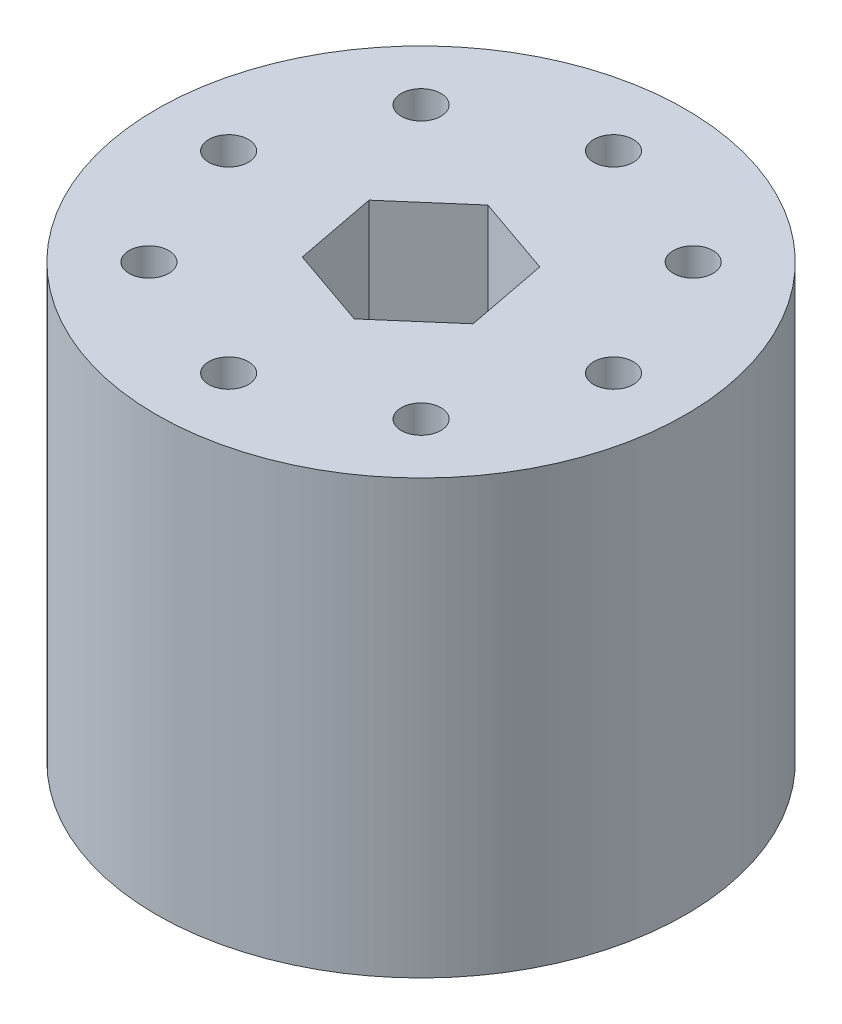
ISO-10303-21;
HEADER;
FILE_DESCRIPTION(('STEP AP214'),'2;1');
FILE_NAME('part.step','',(''),(''),'','','');
FILE_SCHEMA(('AUTOMOTIVE_DESIGN { 1 0 10303 214 1 1 1 1 }'));
ENDSEC;
DATA;
#1=APPLICATION_CONTEXT('core data for automotive mechanical design processes');
#2=APPLICATION_PROTOCOL_DEFINITION('international standard','automotive_design',2000,#1);
#3=PRODUCT_CONTEXT('',#1,'mechanical');
#4=PRODUCT('Part','Part','',(#3));
#5=PRODUCT_RELATED_PRODUCT_CATEGORY('part','',(#4));
#6=PRODUCT_DEFINITION_FORMATION('','',#4);
#7=PRODUCT_DEFINITION_CONTEXT('part definition',#1,'design');
#8=PRODUCT_DEFINITION('design','',#6,#7);
#9=PRODUCT_DEFINITION_SHAPE('','',#8);
#10=(LENGTH_UNIT() NAMED_UNIT(*) SI_UNIT(.MILLI.,.METRE.));
#11=(NAMED_UNIT(*) PLANE_ANGLE_UNIT() SI_UNIT($,.RADIAN.));
#12=(NAMED_UNIT(*) SI_UNIT($,.STERADIAN.) SOLID_ANGLE_UNIT());
#13=UNCERTAINTY_MEASURE_WITH_UNIT(LENGTH_MEASURE(1.E-05),#10,'distance_accuracy_value','');
#14=(GEOMETRIC_REPRESENTATION_CONTEXT(3) GLOBAL_UNCERTAINTY_ASSIGNED_CONTEXT((#13)) GLOBAL_UNIT_ASSIGNED_CONTEXT((#10,
#11,#12)) REPRESENTATION_CONTEXT('',''));
#15=CARTESIAN_POINT('',(0.,0.,0.));
#16=DIRECTION('',(0.,0.,1.));
#17=DIRECTION('',(1.,0.,0.));
#18=AXIS2_PLACEMENT_3D('',#15,#16,#17);
#19=CARTESIAN_POINT('',(0.,-12.,0.));
#20=DIRECTION('',(0.,1.,0.));
#21=DIRECTION('',(0.,0.,1.));
#22=AXIS2_PLACEMENT_3D('',#19,#20,#21);
#23=CYLINDRICAL_SURFACE('',#22,2.3);
#24=CARTESIAN_POINT('',(0.,26.,0.));
#25=DIRECTION('',(0.,1.,0.));
#26=DIRECTION('',(0.,0.,1.));
#27=AXIS2_PLACEMENT_3D('',#24,#25,#26);
#28=CIRCLE('',#27,2.3);
#29=CARTESIAN_POINT('',(0.,26.,2.3));
#30=VERTEX_POINT('',#29);
#31=EDGE_CURVE('E134',#30,#30,#28,.T.);
#32=ORIENTED_EDGE('',*,*,#31,.T.);
#33=EDGE_LOOP('',(#32));
#34=FACE_BOUND('',#33,.T.);
#35=CARTESIAN_POINT('',(0.,8.99999999999998,0.));
#36=DIRECTION('',(0.,-1.,0.));
#37=DIRECTION('',(0.,0.,-1.));
#38=AXIS2_PLACEMENT_3D('',#35,#36,#37);
#39=CIRCLE('',#38,2.3);
#40=CARTESIAN_POINT('',(0.,8.99999999999998,-2.3));
#41=VERTEX_POINT('',#40);
#42=EDGE_CURVE('E46',#41,#41,#39,.F.);
#43=ORIENTED_EDGE('',*,*,#42,.F.);
#44=EDGE_LOOP('',(#43));
#45=FACE_BOUND('',#44,.T.);
#46=ADVANCED_FACE('F42',(#34,#45),#23,.F.);
#47=CARTESIAN_POINT('',(0.,36.,0.));
#48=DIRECTION('',(0.,-1.,0.));
#49=DIRECTION('',(0.,0.,-1.));
#50=AXIS2_PLACEMENT_3D('',#47,#48,#49);
#51=CYLINDRICAL_SURFACE('',#50,22.);
#52=CARTESIAN_POINT('',(0.,36.,0.));
#53=DIRECTION('',(0.,1.,0.));
#54=DIRECTION('',(0.,0.,1.));
#55=AXIS2_PLACEMENT_3D('',#52,#53,#54);
#56=CIRCLE('',#55,22.);
#57=CARTESIAN_POINT('',(0.,36.,22.));
#58=VERTEX_POINT('',#57);
#59=EDGE_CURVE('E11',#58,#58,#56,.T.);
#60=ORIENTED_EDGE('',*,*,#59,.F.);
#61=EDGE_LOOP('',(#60));
#62=FACE_BOUND('',#61,.T.);
#63=CARTESIAN_POINT('',(0.,0.,0.));
#64=DIRECTION('',(0.,1.,0.));
#65=DIRECTION('',(0.,0.,1.));
#66=AXIS2_PLACEMENT_3D('',#63,#64,#65);
#67=CIRCLE('',#66,22.);
#68=CARTESIAN_POINT('',(0.,0.,22.));
#69=VERTEX_POINT('',#68);
#70=EDGE_CURVE('E51',#69,#69,#67,.T.);
#71=ORIENTED_EDGE('',*,*,#70,.T.);
#72=EDGE_LOOP('',(#71));
#73=FACE_BOUND('',#72,.T.);
#74=ADVANCED_FACE('F44',(#62,#73),#51,.T.);
#75=CARTESIAN_POINT('',(0.,36.,0.));
#76=DIRECTION('',(0.,1.,0.));
#77=DIRECTION('',(0.,0.,1.));
#78=AXIS2_PLACEMENT_3D('',#75,#76,#77);
#79=PLANE('',#78);
#80=DIRECTION('',(0.944854855791401,0.,0.327489391412012));
#81=VECTOR('',#80,1.);
#82=CARTESIAN_POINT('',(-5.29229092229886,36.,4.58166528608901));
#83=LINE('',#82,#81);
#84=CARTESIAN_POINT('',(-5.29229092229886,36.,4.58166528608901));
#85=VERTEX_POINT('',#84);
#86=CARTESIAN_POINT('',(1.32169306824095,36.,6.87409102597309));
#87=VERTEX_POINT('',#86);
#88=EDGE_CURVE('E59',#85,#87,#83,.T.);
#89=ORIENTED_EDGE('',*,*,#88,.F.);
#90=DIRECTION('',(0.188813295462993,0.,0.982013003710442));
#91=VECTOR('',#90,1.);
#92=CARTESIAN_POINT('',(-6.61398399053981,36.,-2.29242573988408));
#93=LINE('',#92,#91);
#94=CARTESIAN_POINT('',(-6.61398399053981,36.,-2.29242573988408));
#95=VERTEX_POINT('',#94);
#96=EDGE_CURVE('E143',#95,#85,#93,.T.);
#97=ORIENTED_EDGE('',*,*,#96,.F.);
#98=DIRECTION('',(-0.756041560328408,0.,0.65452361229843));
#99=VECTOR('',#98,1.);
#100=CARTESIAN_POINT('',(-1.32169306824095,36.,-6.8740910259731));
#101=LINE('',#100,#99);
#102=CARTESIAN_POINT('',(-1.32169306824095,36.,-6.8740910259731));
#103=VERTEX_POINT('',#102);
#104=EDGE_CURVE('E141',#103,#95,#101,.T.);
#105=ORIENTED_EDGE('',*,*,#104,.F.);
#106=DIRECTION('',(-0.944854855791401,0.,-0.327489391412012));
#107=VECTOR('',#106,1.);
#108=CARTESIAN_POINT('',(5.29229092229886,36.,-4.58166528608901));
#109=LINE('',#108,#107);
#110=CARTESIAN_POINT('',(5.29229092229886,36.,-4.58166528608901));
#111=VERTEX_POINT('',#110);
#112=EDGE_CURVE('E107',#111,#103,#109,.T.);
#113=ORIENTED_EDGE('',*,*,#112,.F.);
#114=DIRECTION('',(-0.188813295462993,0.,-0.982013003710442));
#115=VECTOR('',#114,1.);
#116=CARTESIAN_POINT('',(6.61398399053981,36.,2.29242573988408));
#117=LINE('',#116,#115);
#118=CARTESIAN_POINT('',(6.61398399053981,36.,2.29242573988408));
#119=VERTEX_POINT('',#118);
#120=EDGE_CURVE('E137',#119,#111,#117,.T.);
#121=ORIENTED_EDGE('',*,*,#120,.F.);
#122=DIRECTION('',(0.756041560328408,0.,-0.65452361229843));
#123=VECTOR('',#122,1.);
#124=CARTESIAN_POINT('',(1.32169306824095,36.,6.87409102597309));
#125=LINE('',#124,#123);
#126=EDGE_CURVE('E133',#87,#119,#125,.T.);
#127=ORIENTED_EDGE('',*,*,#126,.F.);
#128=EDGE_LOOP('',(#89,#97,#105,#113,#121,#127));
#129=FACE_BOUND('',#128,.T.);
#130=CARTESIAN_POINT('',(0.,36.,-16.0000000000005));
#131=DIRECTION('',(0.,1.,0.));
#132=DIRECTION('',(0.,0.,1.));
#133=AXIS2_PLACEMENT_3D('',#130,#131,#132);
#134=CIRCLE('',#133,1.6500000000007);
#135=CARTESIAN_POINT('',(0.,36.,-14.3499999999998));
#136=VERTEX_POINT('',#135);
#137=EDGE_CURVE('E197',#136,#136,#134,.T.);
#138=ORIENTED_EDGE('',*,*,#137,.F.);
#139=EDGE_LOOP('',(#138));
#140=FACE_BOUND('',#139,.T.);
#141=CARTESIAN_POINT('',(11.3137084989851,36.,-11.3137084989851));
#142=DIRECTION('',(0.,1.,0.));
#143=DIRECTION('',(0.,0.,1.));
#144=AXIS2_PLACEMENT_3D('',#141,#142,#143);
#145=CIRCLE('',#144,1.65000000000109);
#146=CARTESIAN_POINT('',(11.3137084989851,36.,-9.66370849898399));
#147=VERTEX_POINT('',#146);
#148=EDGE_CURVE('E194',#147,#147,#145,.T.);
#149=ORIENTED_EDGE('',*,*,#148,.F.);
#150=EDGE_LOOP('',(#149));
#151=FACE_BOUND('',#150,.T.);
#152=CARTESIAN_POINT('',(16.0000000000005,36.,0.));
#153=DIRECTION('',(0.,1.,0.));
#154=DIRECTION('',(0.,0.,1.));
#155=AXIS2_PLACEMENT_3D('',#152,#153,#154);
#156=CIRCLE('',#155,1.65000000000072);
#157=CARTESIAN_POINT('',(16.0000000000005,36.,1.65000000000073));
#158=VERTEX_POINT('',#157);
#159=EDGE_CURVE('E191',#158,#158,#156,.T.);
#160=ORIENTED_EDGE('',*,*,#159,.F.);
#161=EDGE_LOOP('',(#160));
#162=FACE_BOUND('',#161,.T.);
#163=CARTESIAN_POINT('',(11.3137084989851,36.,11.3137084989851));
#164=DIRECTION('',(0.,1.,0.));
#165=DIRECTION('',(0.,0.,1.));
#166=AXIS2_PLACEMENT_3D('',#163,#164,#165);
#167=CIRCLE('',#166,1.65000000000037);
#168=CARTESIAN_POINT('',(11.3137084989851,36.,12.9637084989855));
#169=VERTEX_POINT('',#168);
#170=EDGE_CURVE('E188',#169,#169,#167,.T.);
#171=ORIENTED_EDGE('',*,*,#170,.F.);
#172=EDGE_LOOP('',(#171));
#173=FACE_BOUND('',#172,.T.);
#174=CARTESIAN_POINT('',(0.,36.,16.0000000000005));
#175=DIRECTION('',(0.,1.,0.));
#176=DIRECTION('',(0.,0.,1.));
#177=AXIS2_PLACEMENT_3D('',#174,#175,#176);
#178=CIRCLE('',#177,1.65000000000072);
#179=CARTESIAN_POINT('',(0.,36.,17.6500000000012));
#180=VERTEX_POINT('',#179);
#181=EDGE_CURVE('E185',#180,#180,#178,.T.);
#182=ORIENTED_EDGE('',*,*,#181,.F.);
#183=EDGE_LOOP('',(#182));
#184=FACE_BOUND('',#183,.T.);
#185=CARTESIAN_POINT('',(-11.3137084989851,36.,11.3137084989851));
#186=DIRECTION('',(0.,1.,0.));
#187=DIRECTION('',(0.,0.,1.));
#188=AXIS2_PLACEMENT_3D('',#185,#186,#187);
#189=CIRCLE('',#188,1.65000000000033);
#190=CARTESIAN_POINT('',(-11.3137084989851,36.,12.9637084989854));
#191=VERTEX_POINT('',#190);
#192=EDGE_CURVE('E182',#191,#191,#189,.T.);
#193=ORIENTED_EDGE('',*,*,#192,.F.);
#194=EDGE_LOOP('',(#193));
#195=FACE_BOUND('',#194,.T.);
#196=CARTESIAN_POINT('',(-16.0000000000005,36.,0.));
#197=DIRECTION('',(0.,1.,0.));
#198=DIRECTION('',(0.,0.,1.));
#199=AXIS2_PLACEMENT_3D('',#196,#197,#198);
#200=CIRCLE('',#199,1.65000000000071);
#201=CARTESIAN_POINT('',(-16.0000000000005,36.,1.65000000000071));
#202=VERTEX_POINT('',#201);
#203=EDGE_CURVE('E179',#202,#202,#200,.T.);
#204=ORIENTED_EDGE('',*,*,#203,.F.);
#205=EDGE_LOOP('',(#204));
#206=FACE_BOUND('',#205,.T.);
#207=CARTESIAN_POINT('',(-11.3137084989851,36.,-11.3137084989851));
#208=DIRECTION('',(0.,1.,0.));
#209=DIRECTION('',(0.,0.,1.));
#210=AXIS2_PLACEMENT_3D('',#207,#208,#209);
#211=CIRCLE('',#210,1.65000000000105);
#212=CARTESIAN_POINT('',(-11.3137084989851,36.,-9.66370849898404));
#213=VERTEX_POINT('',#212);
#214=EDGE_CURVE('E176',#213,#213,#211,.T.);
#215=ORIENTED_EDGE('',*,*,#214,.F.);
#216=EDGE_LOOP('',(#215));
#217=FACE_BOUND('',#216,.T.);
#218=ORIENTED_EDGE('',*,*,#59,.T.);
#219=EDGE_LOOP('',(#218));
#220=FACE_BOUND('',#219,.T.);
#221=ADVANCED_FACE('F206',(#129,#140,#151,#162,#173,#184,#195,#206,#217,#220),#79,.T.);
#222=CARTESIAN_POINT('',(0.,0.,0.));
#223=DIRECTION('',(0.,1.,0.));
#224=DIRECTION('',(0.,0.,1.));
#225=AXIS2_PLACEMENT_3D('',#222,#223,#224);
#226=PLANE('',#225);
#227=CARTESIAN_POINT('',(0.,0.,0.));
#228=DIRECTION('',(0.,-1.,0.));
#229=DIRECTION('',(0.,0.,-1.));
#230=AXIS2_PLACEMENT_3D('',#227,#228,#229);
#231=CIRCLE('',#230,5.59540043034474);
#232=CARTESIAN_POINT('',(0.,0.,-5.59540043034474));
#233=VERTEX_POINT('',#232);
#234=EDGE_CURVE('E474',#233,#233,#231,.T.);
#235=ORIENTED_EDGE('',*,*,#234,.F.);
#236=EDGE_LOOP('',(#235));
#237=FACE_BOUND('',#236,.T.);
#238=CARTESIAN_POINT('',(0.,0.,-16.0000000000005));
#239=DIRECTION('',(0.,1.,0.));
#240=DIRECTION('',(0.,0.,1.));
#241=AXIS2_PLACEMENT_3D('',#238,#239,#240);
#242=CIRCLE('',#241,1.6500000000007);
#243=CARTESIAN_POINT('',(0.,0.,-14.3499999999998));
#244=VERTEX_POINT('',#243);
#245=EDGE_CURVE('E162',#244,#244,#242,.T.);
#246=ORIENTED_EDGE('',*,*,#245,.T.);
#247=EDGE_LOOP('',(#246));
#248=FACE_BOUND('',#247,.T.);
#249=CARTESIAN_POINT('',(11.3137084989851,0.,-11.3137084989851));
#250=DIRECTION('',(0.,1.,0.));
#251=DIRECTION('',(0.,0.,1.));
#252=AXIS2_PLACEMENT_3D('',#249,#250,#251);
#253=CIRCLE('',#252,1.65000000000109);
#254=CARTESIAN_POINT('',(11.3137084989851,0.,-9.66370849898399));
#255=VERTEX_POINT('',#254);
#256=EDGE_CURVE('E166',#255,#255,#253,.T.);
#257=ORIENTED_EDGE('',*,*,#256,.T.);
#258=EDGE_LOOP('',(#257));
#259=FACE_BOUND('',#258,.T.);
#260=CARTESIAN_POINT('',(16.0000000000005,0.,0.));
#261=DIRECTION('',(0.,1.,0.));
#262=DIRECTION('',(0.,0.,1.));
#263=AXIS2_PLACEMENT_3D('',#260,#261,#262);
#264=CIRCLE('',#263,1.65000000000072);
#265=CARTESIAN_POINT('',(16.0000000000005,0.,1.65000000000073));
#266=VERTEX_POINT('',#265);
#267=EDGE_CURVE('E169',#266,#266,#264,.T.);
#268=ORIENTED_EDGE('',*,*,#267,.T.);
#269=EDGE_LOOP('',(#268));
#270=FACE_BOUND('',#269,.T.);
#271=CARTESIAN_POINT('',(11.3137084989851,0.,11.3137084989851));
#272=DIRECTION('',(0.,1.,0.));
#273=DIRECTION('',(0.,0.,1.));
#274=AXIS2_PLACEMENT_3D('',#271,#272,#273);
#275=CIRCLE('',#274,1.65000000000037);
#276=CARTESIAN_POINT('',(11.3137084989851,0.,12.9637084989855));
#277=VERTEX_POINT('',#276);
#278=EDGE_CURVE('E156',#277,#277,#275,.T.);
#279=ORIENTED_EDGE('',*,*,#278,.T.);
#280=EDGE_LOOP('',(#279));
#281=FACE_BOUND('',#280,.T.);
#282=CARTESIAN_POINT('',(0.,0.,16.0000000000005));
#283=DIRECTION('',(0.,1.,0.));
#284=DIRECTION('',(0.,0.,1.));
#285=AXIS2_PLACEMENT_3D('',#282,#283,#284);
#286=CIRCLE('',#285,1.65000000000072);
#287=CARTESIAN_POINT('',(0.,0.,17.6500000000012));
#288=VERTEX_POINT('',#287);
#289=EDGE_CURVE('E153',#288,#288,#286,.T.);
#290=ORIENTED_EDGE('',*,*,#289,.T.);
#291=EDGE_LOOP('',(#290));
#292=FACE_BOUND('',#291,.T.);
#293=CARTESIAN_POINT('',(-11.3137084989851,0.,11.3137084989851));
#294=DIRECTION('',(0.,1.,0.));
#295=DIRECTION('',(0.,0.,1.));
#296=AXIS2_PLACEMENT_3D('',#293,#294,#295);
#297=CIRCLE('',#296,1.65000000000033);
#298=CARTESIAN_POINT('',(-11.3137084989851,0.,12.9637084989854));
#299=VERTEX_POINT('',#298);
#300=EDGE_CURVE('E157',#299,#299,#297,.T.);
#301=ORIENTED_EDGE('',*,*,#300,.T.);
#302=EDGE_LOOP('',(#301));
#303=FACE_BOUND('',#302,.T.);
#304=CARTESIAN_POINT('',(-16.0000000000005,0.,0.));
#305=DIRECTION('',(0.,1.,0.));
#306=DIRECTION('',(0.,0.,1.));
#307=AXIS2_PLACEMENT_3D('',#304,#305,#306);
#308=CIRCLE('',#307,1.65000000000071);
#309=CARTESIAN_POINT('',(-16.0000000000005,0.,1.65000000000071));
#310=VERTEX_POINT('',#309);
#311=EDGE_CURVE('E147',#310,#310,#308,.T.);
#312=ORIENTED_EDGE('',*,*,#311,.T.);
#313=EDGE_LOOP('',(#312));
#314=FACE_BOUND('',#313,.T.);
#315=CARTESIAN_POINT('',(-11.3137084989851,0.,-11.3137084989851));
#316=DIRECTION('',(0.,1.,0.));
#317=DIRECTION('',(0.,0.,1.));
#318=AXIS2_PLACEMENT_3D('',#315,#316,#317);
#319=CIRCLE('',#318,1.65000000000105);
#320=CARTESIAN_POINT('',(-11.3137084989851,0.,-9.66370849898404));
#321=VERTEX_POINT('',#320);
#322=EDGE_CURVE('E165',#321,#321,#319,.T.);
#323=ORIENTED_EDGE('',*,*,#322,.T.);
#324=EDGE_LOOP('',(#323));
#325=FACE_BOUND('',#324,.T.);
#326=ORIENTED_EDGE('',*,*,#70,.F.);
#327=EDGE_LOOP('',(#326));
#328=FACE_BOUND('',#327,.T.);
#329=ADVANCED_FACE('F203',(#237,#248,#259,#270,#281,#292,#303,#314,#325,#328),#226,.F.);
#330=CARTESIAN_POINT('',(-11.3137084989851,0.,-11.3137084989851));
#331=DIRECTION('',(0.,1.,0.));
#332=DIRECTION('',(0.,0.,1.));
#333=AXIS2_PLACEMENT_3D('',#330,#331,#332);
#334=CYLINDRICAL_SURFACE('',#333,1.65000000000105);
#335=ORIENTED_EDGE('',*,*,#214,.T.);
#336=EDGE_LOOP('',(#335));
#337=FACE_BOUND('',#336,.T.);
#338=ORIENTED_EDGE('',*,*,#322,.F.);
#339=EDGE_LOOP('',(#338));
#340=FACE_BOUND('',#339,.T.);
#341=ADVANCED_FACE('F205',(#337,#340),#334,.F.);
#342=CARTESIAN_POINT('',(-16.0000000000005,0.,0.));
#343=DIRECTION('',(0.,1.,0.));
#344=DIRECTION('',(0.,0.,1.));
#345=AXIS2_PLACEMENT_3D('',#342,#343,#344);
#346=CYLINDRICAL_SURFACE('',#345,1.65000000000071);
#347=ORIENTED_EDGE('',*,*,#203,.T.);
#348=EDGE_LOOP('',(#347));
#349=FACE_BOUND('',#348,.T.);
#350=ORIENTED_EDGE('',*,*,#311,.F.);
#351=EDGE_LOOP('',(#350));
#352=FACE_BOUND('',#351,.T.);
#353=ADVANCED_FACE('F213',(#349,#352),#346,.F.);
#354=CARTESIAN_POINT('',(-11.3137084989851,0.,11.3137084989851));
#355=DIRECTION('',(0.,1.,0.));
#356=DIRECTION('',(0.,0.,1.));
#357=AXIS2_PLACEMENT_3D('',#354,#355,#356);
#358=CYLINDRICAL_SURFACE('',#357,1.65000000000033);
#359=ORIENTED_EDGE('',*,*,#192,.T.);
#360=EDGE_LOOP('',(#359));
#361=FACE_BOUND('',#360,.T.);
#362=ORIENTED_EDGE('',*,*,#300,.F.);
#363=EDGE_LOOP('',(#362));
#364=FACE_BOUND('',#363,.T.);
#365=ADVANCED_FACE('F260',(#361,#364),#358,.F.);
#366=CARTESIAN_POINT('',(0.,0.,16.0000000000005));
#367=DIRECTION('',(0.,1.,0.));
#368=DIRECTION('',(0.,0.,1.));
#369=AXIS2_PLACEMENT_3D('',#366,#367,#368);
#370=CYLINDRICAL_SURFACE('',#369,1.65000000000072);
#371=ORIENTED_EDGE('',*,*,#181,.T.);
#372=EDGE_LOOP('',(#371));
#373=FACE_BOUND('',#372,.T.);
#374=ORIENTED_EDGE('',*,*,#289,.F.);
#375=EDGE_LOOP('',(#374));
#376=FACE_BOUND('',#375,.T.);
#377=ADVANCED_FACE('F256',(#373,#376),#370,.F.);
#378=CARTESIAN_POINT('',(11.3137084989851,0.,11.3137084989851));
#379=DIRECTION('',(0.,1.,0.));
#380=DIRECTION('',(0.,0.,1.));
#381=AXIS2_PLACEMENT_3D('',#378,#379,#380);
#382=CYLINDRICAL_SURFACE('',#381,1.65000000000037);
#383=ORIENTED_EDGE('',*,*,#170,.T.);
#384=EDGE_LOOP('',(#383));
#385=FACE_BOUND('',#384,.T.);
#386=ORIENTED_EDGE('',*,*,#278,.F.);
#387=EDGE_LOOP('',(#386));
#388=FACE_BOUND('',#387,.T.);
#389=ADVANCED_FACE('F259',(#385,#388),#382,.F.);
#390=CARTESIAN_POINT('',(16.0000000000005,0.,0.));
#391=DIRECTION('',(0.,1.,0.));
#392=DIRECTION('',(0.,0.,1.));
#393=AXIS2_PLACEMENT_3D('',#390,#391,#392);
#394=CYLINDRICAL_SURFACE('',#393,1.65000000000072);
#395=ORIENTED_EDGE('',*,*,#159,.T.);
#396=EDGE_LOOP('',(#395));
#397=FACE_BOUND('',#396,.T.);
#398=ORIENTED_EDGE('',*,*,#267,.F.);
#399=EDGE_LOOP('',(#398));
#400=FACE_BOUND('',#399,.T.);
#401=ADVANCED_FACE('F274',(#397,#400),#394,.F.);
#402=CARTESIAN_POINT('',(11.3137084989851,0.,-11.3137084989851));
#403=DIRECTION('',(0.,1.,0.));
#404=DIRECTION('',(0.,0.,1.));
#405=AXIS2_PLACEMENT_3D('',#402,#403,#404);
#406=CYLINDRICAL_SURFACE('',#405,1.65000000000109);
#407=ORIENTED_EDGE('',*,*,#148,.T.);
#408=EDGE_LOOP('',(#407));
#409=FACE_BOUND('',#408,.T.);
#410=ORIENTED_EDGE('',*,*,#256,.F.);
#411=EDGE_LOOP('',(#410));
#412=FACE_BOUND('',#411,.T.);
#413=ADVANCED_FACE('F270',(#409,#412),#406,.F.);
#414=CARTESIAN_POINT('',(0.,0.,-16.0000000000005));
#415=DIRECTION('',(0.,1.,0.));
#416=DIRECTION('',(0.,0.,1.));
#417=AXIS2_PLACEMENT_3D('',#414,#415,#416);
#418=CYLINDRICAL_SURFACE('',#417,1.6500000000007);
#419=ORIENTED_EDGE('',*,*,#137,.T.);
#420=EDGE_LOOP('',(#419));
#421=FACE_BOUND('',#420,.T.);
#422=ORIENTED_EDGE('',*,*,#245,.F.);
#423=EDGE_LOOP('',(#422));
#424=FACE_BOUND('',#423,.T.);
#425=ADVANCED_FACE('F255',(#421,#424),#418,.F.);
#426=CARTESIAN_POINT('',(-5.29229092229886,26.,4.58166528608901));
#427=DIRECTION('',(-0.327489391412012,0.,0.944854855791401));
#428=DIRECTION('',(0.944854855791401,0.,0.327489391412012));
#429=AXIS2_PLACEMENT_3D('',#426,#427,#428);
#430=PLANE('',#429);
#431=ORIENTED_EDGE('',*,*,#88,.T.);
#432=DIRECTION('',(0.,1.,0.));
#433=VECTOR('',#432,1.);
#434=CARTESIAN_POINT('',(1.32169306824095,26.,6.87409102597309));
#435=LINE('',#434,#433);
#436=CARTESIAN_POINT('',(1.32169306824095,26.,6.87409102597309));
#437=VERTEX_POINT('',#436);
#438=EDGE_CURVE('E89',#437,#87,#435,.T.);
#439=ORIENTED_EDGE('',*,*,#438,.F.);
#440=DIRECTION('',(0.944854855791401,0.,0.327489391412012));
#441=VECTOR('',#440,1.);
#442=CARTESIAN_POINT('',(-5.29229092229886,26.,4.58166528608901));
#443=LINE('',#442,#441);
#444=CARTESIAN_POINT('',(-5.29229092229886,26.,4.58166528608901));
#445=VERTEX_POINT('',#444);
#446=EDGE_CURVE('E145',#445,#437,#443,.T.);
#447=ORIENTED_EDGE('',*,*,#446,.F.);
#448=DIRECTION('',(0.,1.,0.));
#449=VECTOR('',#448,1.);
#450=CARTESIAN_POINT('',(-5.29229092229886,26.,4.58166528608901));
#451=LINE('',#450,#449);
#452=EDGE_CURVE('E67',#445,#85,#451,.T.);
#453=ORIENTED_EDGE('',*,*,#452,.T.);
#454=EDGE_LOOP('',(#431,#439,#447,#453));
#455=FACE_BOUND('',#454,.T.);
#456=ADVANCED_FACE('F241',(#455),#430,.F.);
#457=CARTESIAN_POINT('',(-6.61398399053981,26.,-2.29242573988408));
#458=DIRECTION('',(-0.982013003710442,0.,0.188813295462993));
#459=DIRECTION('',(0.188813295462993,0.,0.982013003710442));
#460=AXIS2_PLACEMENT_3D('',#457,#458,#459);
#461=PLANE('',#460);
#462=ORIENTED_EDGE('',*,*,#96,.T.);
#463=ORIENTED_EDGE('',*,*,#452,.F.);
#464=DIRECTION('',(0.188813295462993,0.,0.982013003710442));
#465=VECTOR('',#464,1.);
#466=CARTESIAN_POINT('',(-6.61398399053981,26.,-2.29242573988408));
#467=LINE('',#466,#465);
#468=CARTESIAN_POINT('',(-6.61398399053981,26.,-2.29242573988408));
#469=VERTEX_POINT('',#468);
#470=EDGE_CURVE('E119',#469,#445,#467,.T.);
#471=ORIENTED_EDGE('',*,*,#470,.F.);
#472=DIRECTION('',(0.,1.,0.));
#473=VECTOR('',#472,1.);
#474=CARTESIAN_POINT('',(-6.61398399053981,26.,-2.29242573988408));
#475=LINE('',#474,#473);
#476=EDGE_CURVE('E111',#469,#95,#475,.T.);
#477=ORIENTED_EDGE('',*,*,#476,.T.);
#478=EDGE_LOOP('',(#462,#463,#471,#477));
#479=FACE_BOUND('',#478,.T.);
#480=ADVANCED_FACE('F238',(#479),#461,.F.);
#481=CARTESIAN_POINT('',(-1.32169306824095,26.,-6.8740910259731));
#482=DIRECTION('',(-0.65452361229843,0.,-0.756041560328408));
#483=DIRECTION('',(-0.756041560328408,0.,0.65452361229843));
#484=AXIS2_PLACEMENT_3D('',#481,#482,#483);
#485=PLANE('',#484);
#486=ORIENTED_EDGE('',*,*,#104,.T.);
#487=ORIENTED_EDGE('',*,*,#476,.F.);
#488=DIRECTION('',(-0.756041560328408,0.,0.65452361229843));
#489=VECTOR('',#488,1.);
#490=CARTESIAN_POINT('',(-1.32169306824095,26.,-6.8740910259731));
#491=LINE('',#490,#489);
#492=CARTESIAN_POINT('',(-1.32169306824095,26.,-6.8740910259731));
#493=VERTEX_POINT('',#492);
#494=EDGE_CURVE('E115',#493,#469,#491,.T.);
#495=ORIENTED_EDGE('',*,*,#494,.F.);
#496=DIRECTION('',(0.,1.,0.));
#497=VECTOR('',#496,1.);
#498=CARTESIAN_POINT('',(-1.32169306824095,26.,-6.8740910259731));
#499=LINE('',#498,#497);
#500=EDGE_CURVE('E100',#493,#103,#499,.T.);
#501=ORIENTED_EDGE('',*,*,#500,.T.);
#502=EDGE_LOOP('',(#486,#487,#495,#501));
#503=FACE_BOUND('',#502,.T.);
#504=ADVANCED_FACE('F116',(#503),#485,.F.);
#505=CARTESIAN_POINT('',(5.29229092229886,26.,-4.58166528608901));
#506=DIRECTION('',(0.327489391412012,0.,-0.944854855791401));
#507=DIRECTION('',(-0.944854855791401,0.,-0.327489391412012));
#508=AXIS2_PLACEMENT_3D('',#505,#506,#507);
#509=PLANE('',#508);
#510=ORIENTED_EDGE('',*,*,#112,.T.);
#511=ORIENTED_EDGE('',*,*,#500,.F.);
#512=DIRECTION('',(-0.944854855791401,0.,-0.327489391412012));
#513=VECTOR('',#512,1.);
#514=CARTESIAN_POINT('',(5.29229092229886,26.,-4.58166528608901));
#515=LINE('',#514,#513);
#516=CARTESIAN_POINT('',(5.29229092229886,26.,-4.58166528608901));
#517=VERTEX_POINT('',#516);
#518=EDGE_CURVE('E104',#517,#493,#515,.T.);
#519=ORIENTED_EDGE('',*,*,#518,.F.);
#520=DIRECTION('',(0.,1.,0.));
#521=VECTOR('',#520,1.);
#522=CARTESIAN_POINT('',(5.29229092229886,26.,-4.58166528608901));
#523=LINE('',#522,#521);
#524=EDGE_CURVE('E112',#517,#111,#523,.T.);
#525=ORIENTED_EDGE('',*,*,#524,.T.);
#526=EDGE_LOOP('',(#510,#511,#519,#525));
#527=FACE_BOUND('',#526,.T.);
#528=ADVANCED_FACE('F102',(#527),#509,.F.);
#529=CARTESIAN_POINT('',(6.61398399053981,26.,2.29242573988408));
#530=DIRECTION('',(0.982013003710442,0.,-0.188813295462993));
#531=DIRECTION('',(-0.188813295462993,0.,-0.982013003710442));
#532=AXIS2_PLACEMENT_3D('',#529,#530,#531);
#533=PLANE('',#532);
#534=ORIENTED_EDGE('',*,*,#120,.T.);
#535=ORIENTED_EDGE('',*,*,#524,.F.);
#536=DIRECTION('',(-0.188813295462993,0.,-0.982013003710442));
#537=VECTOR('',#536,1.);
#538=CARTESIAN_POINT('',(6.61398399053981,26.,2.29242573988408));
#539=LINE('',#538,#537);
#540=CARTESIAN_POINT('',(6.61398399053981,26.,2.29242573988408));
#541=VERTEX_POINT('',#540);
#542=EDGE_CURVE('E125',#541,#517,#539,.T.);
#543=ORIENTED_EDGE('',*,*,#542,.F.);
#544=DIRECTION('',(0.,1.,0.));
#545=VECTOR('',#544,1.);
#546=CARTESIAN_POINT('',(6.61398399053981,26.,2.29242573988408));
#547=LINE('',#546,#545);
#548=EDGE_CURVE('E150',#541,#119,#547,.T.);
#549=ORIENTED_EDGE('',*,*,#548,.T.);
#550=EDGE_LOOP('',(#534,#535,#543,#549));
#551=FACE_BOUND('',#550,.T.);
#552=ADVANCED_FACE('F246',(#551),#533,.F.);
#553=CARTESIAN_POINT('',(1.32169306824095,26.,6.87409102597309));
#554=DIRECTION('',(0.65452361229843,0.,0.756041560328408));
#555=DIRECTION('',(0.756041560328409,0.,-0.65452361229843));
#556=AXIS2_PLACEMENT_3D('',#553,#554,#555);
#557=PLANE('',#556);
#558=ORIENTED_EDGE('',*,*,#126,.T.);
#559=ORIENTED_EDGE('',*,*,#548,.F.);
#560=DIRECTION('',(0.756041560328408,0.,-0.65452361229843));
#561=VECTOR('',#560,1.);
#562=CARTESIAN_POINT('',(1.32169306824095,26.,6.87409102597309));
#563=LINE('',#562,#561);
#564=EDGE_CURVE('E127',#437,#541,#563,.T.);
#565=ORIENTED_EDGE('',*,*,#564,.F.);
#566=ORIENTED_EDGE('',*,*,#438,.T.);
#567=EDGE_LOOP('',(#558,#559,#565,#566));
#568=FACE_BOUND('',#567,.T.);
#569=ADVANCED_FACE('F236',(#568),#557,.F.);
#570=CARTESIAN_POINT('',(0.,26.,0.));
#571=DIRECTION('',(0.,1.,0.));
#572=DIRECTION('',(0.,0.,1.));
#573=AXIS2_PLACEMENT_3D('',#570,#571,#572);
#574=PLANE('',#573);
#575=ORIENTED_EDGE('',*,*,#31,.F.);
#576=EDGE_LOOP('',(#575));
#577=FACE_BOUND('',#576,.T.);
#578=ORIENTED_EDGE('',*,*,#446,.T.);
#579=ORIENTED_EDGE('',*,*,#564,.T.);
#580=ORIENTED_EDGE('',*,*,#542,.T.);
#581=ORIENTED_EDGE('',*,*,#518,.T.);
#582=ORIENTED_EDGE('',*,*,#494,.T.);
#583=ORIENTED_EDGE('',*,*,#470,.T.);
#584=EDGE_LOOP('',(#578,#579,#580,#581,#582,#583));
#585=FACE_BOUND('',#584,.T.);
#586=ADVANCED_FACE('F122',(#577,#585),#574,.T.);
#587=CARTESIAN_POINT('',(0.,8.99999999999998,0.));
#588=DIRECTION('',(0.,-1.,0.));
#589=DIRECTION('',(0.,0.,-1.));
#590=AXIS2_PLACEMENT_3D('',#587,#588,#589);
#591=PLANE('',#590);
#592=CARTESIAN_POINT('',(0.,8.99999999999998,0.));
#593=DIRECTION('',(0.,-1.,0.));
#594=DIRECTION('',(0.,0.,-1.));
#595=AXIS2_PLACEMENT_3D('',#592,#593,#594);
#596=CIRCLE('',#595,5.59540043034474);
#597=CARTESIAN_POINT('',(0.,8.99999999999998,-5.59540043034474));
#598=VERTEX_POINT('',#597);
#599=EDGE_CURVE('E472',#598,#598,#596,.T.);
#600=ORIENTED_EDGE('',*,*,#599,.T.);
#601=EDGE_LOOP('',(#600));
#602=FACE_BOUND('',#601,.T.);
#603=ORIENTED_EDGE('',*,*,#42,.T.);
#604=EDGE_LOOP('',(#603));
#605=FACE_BOUND('',#604,.T.);
#606=ADVANCED_FACE('F235',(#602,#605),#591,.T.);
#607=CARTESIAN_POINT('',(0.,8.99999999999998,0.));
#608=DIRECTION('',(0.,-1.,0.));
#609=DIRECTION('',(0.,0.,-1.));
#610=AXIS2_PLACEMENT_3D('',#607,#608,#609);
#611=CYLINDRICAL_SURFACE('',#610,5.59540043034474);
#612=ORIENTED_EDGE('',*,*,#599,.F.);
#613=EDGE_LOOP('',(#612));
#614=FACE_BOUND('',#613,.T.);
#615=ORIENTED_EDGE('',*,*,#234,.T.);
#616=EDGE_LOOP('',(#615));
#617=FACE_BOUND('',#616,.T.);
#618=ADVANCED_FACE('F231',(#614,#617),#611,.F.);
#619=CLOSED_SHELL('',(#46,#74,#221,#329,#341,#353,#365,#377,#389,#401,#413,#425,#456,#480,#504,
#528,#552,#569,#586,#606,#618));
#620=MANIFOLD_SOLID_BREP('B2',#619);
#621=ADVANCED_BREP_SHAPE_REPRESENTATION('',(#18,#620),#14);
#622=SHAPE_DEFINITION_REPRESENTATION(#9,#621);
ENDSEC;
END-ISO-10303-21;
